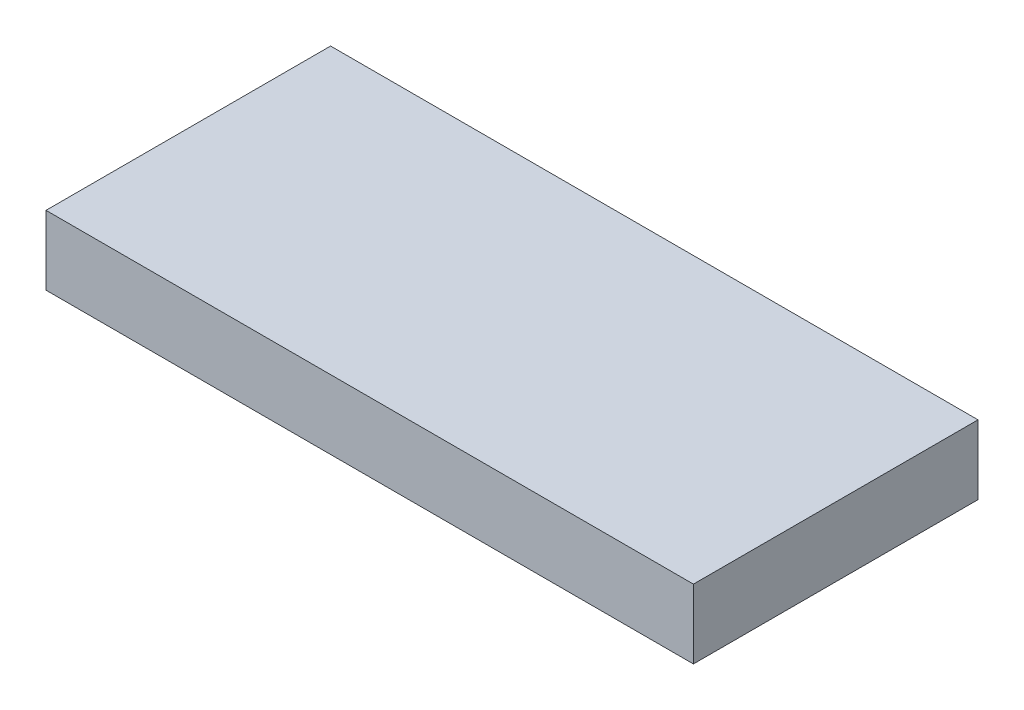
ISO-10303-21;
HEADER;
FILE_DESCRIPTION(('STEP AP214'),'2;1');
FILE_NAME('part.step','',(''),(''),'','','');
FILE_SCHEMA(('AUTOMOTIVE_DESIGN { 1 0 10303 214 1 1 1 1 }'));
ENDSEC;
DATA;
#1=APPLICATION_CONTEXT('core data for automotive mechanical design processes');
#2=APPLICATION_PROTOCOL_DEFINITION('international standard','automotive_design',2000,#1);
#3=PRODUCT_CONTEXT('',#1,'mechanical');
#4=PRODUCT('Part','Part','',(#3));
#5=PRODUCT_RELATED_PRODUCT_CATEGORY('part','',(#4));
#6=PRODUCT_DEFINITION_FORMATION('','',#4);
#7=PRODUCT_DEFINITION_CONTEXT('part definition',#1,'design');
#8=PRODUCT_DEFINITION('design','',#6,#7);
#9=PRODUCT_DEFINITION_SHAPE('','',#8);
#10=(LENGTH_UNIT() NAMED_UNIT(*) SI_UNIT(.MILLI.,.METRE.));
#11=(NAMED_UNIT(*) PLANE_ANGLE_UNIT() SI_UNIT($,.RADIAN.));
#12=(NAMED_UNIT(*) SI_UNIT($,.STERADIAN.) SOLID_ANGLE_UNIT());
#13=UNCERTAINTY_MEASURE_WITH_UNIT(LENGTH_MEASURE(1.E-05),#10,'distance_accuracy_value','');
#14=(GEOMETRIC_REPRESENTATION_CONTEXT(3) GLOBAL_UNCERTAINTY_ASSIGNED_CONTEXT((#13)) GLOBAL_UNIT_ASSIGNED_CONTEXT((#10,
#11,#12)) REPRESENTATION_CONTEXT('',''));
#15=CARTESIAN_POINT('',(0.,0.,0.));
#16=DIRECTION('',(0.,0.,1.));
#17=DIRECTION('',(1.,0.,0.));
#18=AXIS2_PLACEMENT_3D('',#15,#16,#17);
#19=CARTESIAN_POINT('',(-150.,-17.,81.405771285938));
#20=CARTESIAN_POINT('',(-116.638846737262,-17.6672118608523,80.8095738798847));
#21=CARTESIAN_POINT('',(-49.7427742053213,-19.0051108443265,79.6140736942468));
#22=CARTESIAN_POINT('',(50.6317027871444,-21.0127703181343,65.3499909791472));
#23=CARTESIAN_POINT('',(151.227954208533,-23.0240357792725,40.5691423295298));
#24=CARTESIAN_POINT('',(216.774855827415,-24.3366500190966,13.6494309993884));
#25=CARTESIAN_POINT('',(249.9,-25.,0.0451370225326122));
#26=CARTESIAN_POINT('',(-150.,-21.8051540860384,75.7963536954995));
#27=CARTESIAN_POINT('',(-116.638846737262,-22.5655101612967,75.3244737477681));
#28=CARTESIAN_POINT('',(-49.7427742053213,-24.0901827276193,74.3782560027998));
#29=CARTESIAN_POINT('',(50.6317027871444,-25.3526769380671,60.9130466986286));
#30=CARTESIAN_POINT('',(151.227954208533,-26.3707911350128,39.0705039634522));
#31=CARTESIAN_POINT('',(216.774855827415,-27.7472853242932,13.1463238474013));
#32=CARTESIAN_POINT('',(249.9,-28.4429180292189,0.0451370225326118));
#33=CARTESIAN_POINT('',(-150.,-30.4196988845977,63.7246782220816));
#34=CARTESIAN_POINT('',(-116.638846737262,-31.3659657699669,63.4502856806367));
#35=CARTESIAN_POINT('',(-49.7427742053213,-33.2634282977069,62.9000713876785));
#36=CARTESIAN_POINT('',(50.6317027871446,-33.106174464079,51.2985487065188));
#37=CARTESIAN_POINT('',(151.227954208533,-32.7893086977552,34.7857992726971));
#38=CARTESIAN_POINT('',(216.774855827415,-33.8681584780577,11.7060337279786));
#39=CARTESIAN_POINT('',(249.9,-34.4133719607769,0.0423159586243231));
#40=CARTESIAN_POINT('',(-150.,-39.9491696874336,43.6235895569039));
#41=CARTESIAN_POINT('',(-116.638846737262,-41.1292967625243,43.5175237114742));
#42=CARTESIAN_POINT('',(-49.7427742053211,-43.4956977616275,43.3048395625438));
#43=CARTESIAN_POINT('',(50.6317027871442,-41.6370640720175,35.1670631615842));
#44=CARTESIAN_POINT('',(151.227954208534,-40.5287833395358,25.1330207184538));
#45=CARTESIAN_POINT('',(216.774855827415,-40.6321518122783,8.45847664431594));
#46=CARTESIAN_POINT('',(249.9,-40.6843906744964,0.0317369689682422));
#47=CARTESIAN_POINT('',(-150.,-45.7889049113112,22.1583537592279));
#48=CARTESIAN_POINT('',(-116.638846737262,-47.1240890131779,22.1291663050477));
#49=CARTESIAN_POINT('',(-49.7427742053214,-49.8014117009921,22.0706393699479));
#50=CARTESIAN_POINT('',(50.6317027871445,-46.8411508509107,17.8763287205671));
#51=CARTESIAN_POINT('',(151.227954208534,-45.5486295254136,13.1697217970133));
#52=CARTESIAN_POINT('',(216.774855827415,-44.7405878200843,4.43244489076427));
#53=CARTESIAN_POINT('',(249.9,-44.3322314016204,0.0169263834497292));
#54=CARTESIAN_POINT('',(-150.,-47.7559083208649,0.));
#55=CARTESIAN_POINT('',(-116.638846737262,-49.1459003431606,0.));
#56=CARTESIAN_POINT('',(-49.7427742053212,-51.9331243461798,0.));
#57=CARTESIAN_POINT('',(50.6317027871444,-48.5824626978723,0.));
#58=CARTESIAN_POINT('',(151.227954208533,-47.3149233158318,0.));
#59=CARTESIAN_POINT('',(216.774855827415,-46.0550665245405,0.));
#60=CARTESIAN_POINT('',(249.9,-45.4183783391708,0.));
#61=CARTESIAN_POINT('',(-150.,-45.7889049113112,-22.1583537592281));
#62=CARTESIAN_POINT('',(-116.638846737262,-47.1259260630216,-22.1291663050479));
#63=CARTESIAN_POINT('',(-49.7427742053212,-49.8069324190415,-22.0706393699482));
#64=CARTESIAN_POINT('',(50.631702787144,-46.8188095609941,-17.8763287205673));
#65=CARTESIAN_POINT('',(151.227954208535,-45.6344294759758,-13.1697217970134));
#66=CARTESIAN_POINT('',(216.774855827415,-44.5515603869442,-4.43244489076432));
#67=CARTESIAN_POINT('',(249.9,-44.0043156841697,-0.0169263834497295));
#68=CARTESIAN_POINT('',(-150.,-39.9491696874333,-43.6235895569039));
#69=CARTESIAN_POINT('',(-116.638846737262,-41.13228196852,-43.5175237114741));
#70=CARTESIAN_POINT('',(-49.7427742053215,-43.5046689284581,-43.3048395625436));
#71=CARTESIAN_POINT('',(50.6317027871449,-41.6007594759027,-35.1670631615843));
#72=CARTESIAN_POINT('',(151.227954208532,-40.6682082591992,-25.1330207184536));
#73=CARTESIAN_POINT('',(216.774855827415,-40.3249822334255,-8.45847664431589));
#74=CARTESIAN_POINT('',(249.9,-40.1515276336391,-0.0317369689682436));
#75=CARTESIAN_POINT('',(-150.,-30.4196988845977,-63.7246782220818));
#76=CARTESIAN_POINT('',(-116.638846737262,-31.3687213447323,-63.4502856806368));
#77=CARTESIAN_POINT('',(-49.7427742053211,-33.2717093747809,-62.9000713876787));
#78=CARTESIAN_POINT('',(50.631702787144,-33.072662529204,-51.298548706519));
#79=CARTESIAN_POINT('',(151.227954208534,-32.9180086235985,-34.7857992726972));
#80=CARTESIAN_POINT('',(216.774855827415,-33.5846173283475,-11.7060337279786));
#81=CARTESIAN_POINT('',(249.9,-33.921498384601,-0.0423159586243264));
#82=CARTESIAN_POINT('',(-150.,-21.8051540860384,-75.7963536954995));
#83=CARTESIAN_POINT('',(-116.638846737262,-22.5667348611924,-75.3244737477681));
#84=CARTESIAN_POINT('',(-49.7427742053213,-24.0938632063189,-74.3782560027999));
#85=CARTESIAN_POINT('',(50.6317027871444,-25.3377827447892,-60.9130466986286));
#86=CARTESIAN_POINT('',(151.227954208533,-26.4279911020543,-39.0705039634522));
#87=CARTESIAN_POINT('',(216.774855827415,-27.6212670355331,-13.1463238474013));
#88=CARTESIAN_POINT('',(249.9,-28.2243075509185,-0.0451370225326169));
#89=CARTESIAN_POINT('',(-150.,-17.,-81.405771285938));
#90=CARTESIAN_POINT('',(-116.638846737262,-17.6672118608522,-80.8095738798847));
#91=CARTESIAN_POINT('',(-49.7427742053213,-19.0051108443264,-79.614073694247));
#92=CARTESIAN_POINT('',(50.6317027871444,-21.0127703181342,-65.3499909791472));
#93=CARTESIAN_POINT('',(151.227954208533,-23.0240357792725,-40.5691423295299));
#94=CARTESIAN_POINT('',(216.774855827415,-24.3366500190966,-13.6494309993884));
#95=CARTESIAN_POINT('',(249.9,-25.,-0.0451370225326184));
#96=B_SPLINE_SURFACE_WITH_KNOTS('',3,3,((#19,#20,#21,#22,#23,#24,#25),(#26,#27,#28,#29,#30,#31,
#32),(#33,#34,#35,#36,#37,#38,#39),(#40,#41,#42,#43,#44,#45,#46),(#47,#48,#49,#50,#51,#52,#53),
(#54,#55,#56,#57,#58,#59,#60),(#61,#62,#63,#64,#65,#66,#67),(#68,#69,#70,#71,#72,#73,#74),(#75,
#76,#77,#78,#79,#80,#81),(#82,#83,#84,#85,#86,#87,#88),(#89,#90,#91,#92,#93,#94,#95)),
.UNSPECIFIED.,.F.,.F.,.F.,(4,1,1,1,1,1,1,1,4),(4,1,1,1,4),(0.,0.125,0.25,0.375,0.5,0.625,0.75,
0.875,1.),(0.,0.246022042488694,0.493325523526259,0.743944188554489,1.),.UNSPECIFIED.);
#97=CARTESIAN_POINT('',(-150.,-30.000000000094,63.1438135401164));
#98=CARTESIAN_POINT('',(-148.303174488047,-30.0000000000338,63.2109087051731));
#99=CARTESIAN_POINT('',(-146.606322308969,-30.000000000009,63.277348864486));
#100=CARTESIAN_POINT('',(-143.212498847984,-29.999999999991,63.4082834233983));
#101=CARTESIAN_POINT('',(-141.515527564128,-29.9999999999976,63.4727777723948));
#102=CARTESIAN_POINT('',(-138.121462040788,-30.0000000000024,63.5991823874871));
#103=CARTESIAN_POINT('',(-136.424367799808,-30.0000000000006,63.6610926135786));
#104=CARTESIAN_POINT('',(-133.030053619916,-29.9999999999993,63.7817049716669));
#105=CARTESIAN_POINT('',(-131.332833680239,-29.9999999999998,63.8404070822541));
#106=CARTESIAN_POINT('',(-127.93826552419,-30.0000000000002,63.9539883800537));
#107=CARTESIAN_POINT('',(-126.240917307825,-30.,64.0088675674974));
#108=CARTESIAN_POINT('',(-122.846090393193,-30.,64.1141974889702));
#109=CARTESIAN_POINT('',(-121.14861169553,-30.,64.1646482423859));
#110=CARTESIAN_POINT('',(-117.753433092101,-30.,64.260526299464));
#111=CARTESIAN_POINT('',(-116.055733179729,-30.,64.3059533701372));
#112=CARTESIAN_POINT('',(-112.660197008215,-30.,64.3911906408751));
#113=CARTESIAN_POINT('',(-110.962360749514,-30.,64.4310008584292));
#114=CARTESIAN_POINT('',(-107.566547651452,-30.,64.5044202100621));
#115=CARTESIAN_POINT('',(-105.868570811633,-30.,64.538029323094));
#116=CARTESIAN_POINT('',(-102.472472627765,-30.,64.5984675228034));
#117=CARTESIAN_POINT('',(-100.774351282057,-30.,64.6252965168175));
#118=CARTESIAN_POINT('',(-97.3779594205936,-30.,64.6715998564886));
#119=CARTESIAN_POINT('',(-95.6796889019914,-30.,64.6910739961439));
#120=CARTESIAN_POINT('',(-92.2829971369807,-30.,64.722096698709));
#121=CARTESIAN_POINT('',(-90.5845758872372,-30.,64.7336448912877));
#122=CARTESIAN_POINT('',(-85.4777005511371,-30.,64.7555965747348));
#123=CARTESIAN_POINT('',(-82.0691790534721,-30.,64.7531418645007));
#124=CARTESIAN_POINT('',(-75.2521151613664,-30.,64.7094654784167));
#125=CARTESIAN_POINT('',(-71.8435727831338,-30.,64.6682410078079));
#126=CARTESIAN_POINT('',(-66.7313803213126,-30.,64.573938876537));
#127=CARTESIAN_POINT('',(-65.0274220727421,-30.,64.5370940029457));
#128=CARTESIAN_POINT('',(-61.619786899533,-30.,64.4520211481255));
#129=CARTESIAN_POINT('',(-59.9161099749199,-30.,64.4037931658663));
#130=CARTESIAN_POINT('',(-56.5091960956182,-30.,64.2953931343788));
#131=CARTESIAN_POINT('',(-54.8059591270966,-30.,64.2352215228313));
#132=CARTESIAN_POINT('',(-52.2514721688442,-30.,64.1355927523358));
#133=CARTESIAN_POINT('',(-51.4000375501818,-30.,64.1008212522839));
#134=CARTESIAN_POINT('',(-49.6973052302404,-30.,64.0280738154914));
#135=CARTESIAN_POINT('',(-48.8460075289687,-30.,63.9900978785816));
#136=CARTESIAN_POINT('',(-46.2923815641978,-30.,63.8714199545743));
#137=CARTESIAN_POINT('',(-44.5902716752403,-30.,63.7859659515517));
#138=CARTESIAN_POINT('',(-41.1867126235601,-30.,63.6028465417992));
#139=CARTESIAN_POINT('',(-39.4852634615501,-30.,63.5051811219336));
#140=CARTESIAN_POINT('',(-34.3821298354002,-30.,63.1945195524769));
#141=CARTESIAN_POINT('',(-30.981507247715,-30.,62.9638509521825));
#142=CARTESIAN_POINT('',(-24.1835172351267,-30.,62.4586964195533));
#143=CARTESIAN_POINT('',(-20.7861498378634,-30.,62.1842101184237));
#144=CARTESIAN_POINT('',(-13.9947932701885,-30.,61.5945509679733));
#145=CARTESIAN_POINT('',(-10.6008042682078,-30.,61.2793761833686));
#146=CARTESIAN_POINT('',(-3.81632360834457,-30.,60.6113582098535));
#147=CARTESIAN_POINT('',(-0.425832193290021,-30.,60.2585125627398));
#148=CARTESIAN_POINT('',(6.35153114557136,-30.,59.5180860243212));
#149=CARTESIAN_POINT('',(9.73840286456164,-30.,59.1305032628925));
#150=CARTESIAN_POINT('',(16.5083946786765,-30.,58.3234722531869));
#151=CARTESIAN_POINT('',(19.8915147109152,-30.,57.9040234787241));
#152=CARTESIAN_POINT('',(26.6538703401469,-30.,57.036077348936));
#153=CARTESIAN_POINT('',(30.0331061013356,-30.,56.5875812711835));
#154=CARTESIAN_POINT('',(35.4304408887764,-30.,55.8498060895503));
#155=CARTESIAN_POINT('',(37.4497022512696,-30.,55.5689881368893));
#156=CARTESIAN_POINT('',(41.4868479699227,-30.,54.9985166756687));
#157=CARTESIAN_POINT('',(43.5047324048297,-30.,54.7088637249445));
#158=CARTESIAN_POINT('',(46.5306102530659,-30.,54.2681598203254));
#159=CARTESIAN_POINT('',(47.5390586802216,-30.,54.1202240110798));
#160=CARTESIAN_POINT('',(49.5556611062366,-30.,53.8223589800068));
#161=CARTESIAN_POINT('',(50.5638151050935,-30.,53.672429758163));
#162=CARTESIAN_POINT('',(53.5877908081136,-30.,53.2196346994404));
#163=CARTESIAN_POINT('',(55.6031624935621,-30.,52.913756185464));
#164=CARTESIAN_POINT('',(59.6325741740228,-30.,52.2932666218014));
#165=CARTESIAN_POINT('',(61.6466141608582,-30.,51.9786555189959));
#166=CARTESIAN_POINT('',(65.6729067879237,-30.,51.3400965315165));
#167=CARTESIAN_POINT('',(67.6851596498867,-30.,51.0161500460558));
#168=CARTESIAN_POINT('',(71.7080514048187,-30.,50.358196349437));
#169=CARTESIAN_POINT('',(73.7186902736374,-30.,50.0241889905155));
#170=CARTESIAN_POINT('',(77.7381668563762,-30.,49.3454363570875));
#171=CARTESIAN_POINT('',(79.7470045608019,-30.,49.0006910263164));
#172=CARTESIAN_POINT('',(83.7626893900216,-30.,48.2997723911528));
#173=CARTESIAN_POINT('',(85.7695365121799,-30.,47.9435990716493));
#174=CARTESIAN_POINT('',(89.7810485265083,-30.,47.2191213481386));
#175=CARTESIAN_POINT('',(91.7857134111312,-30.,46.8508169023133));
#176=CARTESIAN_POINT('',(95.7941160974211,-30.,46.1010881665573));
#177=CARTESIAN_POINT('',(97.7978521325725,-30.,45.719654425564));
#178=CARTESIAN_POINT('',(101.802697049571,-30.,44.9431945431398));
#179=CARTESIAN_POINT('',(103.803805923334,-30.,44.5481683599839));
#180=CARTESIAN_POINT('',(107.803145334671,-30.,43.7437839979624));
#181=CARTESIAN_POINT('',(109.801375868994,-30.,43.3344258029281));
#182=CARTESIAN_POINT('',(113.794704394706,-30.,42.5006229113007));
#183=CARTESIAN_POINT('',(115.789802362787,-30.,42.0761781030077));
#184=CARTESIAN_POINT('',(119.776608410611,-30.,41.2114327356625));
#185=CARTESIAN_POINT('',(121.768316412801,-30.,40.7711318188397));
#186=CARTESIAN_POINT('',(125.748045075474,-30.,39.8738991782947));
#187=CARTESIAN_POINT('',(127.736065629517,-30.,39.4169669821186));
#188=CARTESIAN_POINT('',(131.708046624629,-30.,38.4857018283268));
#189=CARTESIAN_POINT('',(133.692007030315,-30.,38.0113687197462));
#190=CARTESIAN_POINT('',(137.655456690163,-30.,37.0445335916654));
#191=CARTESIAN_POINT('',(139.634946040606,-30.,36.5520319674526));
#192=CARTESIAN_POINT('',(142.600524170553,-30.,35.7990712610573));
#193=CARTESIAN_POINT('',(143.588422377687,-30.,35.5457212057149));
#194=CARTESIAN_POINT('',(145.562966713574,-30.,35.0341859320255));
#195=CARTESIAN_POINT('',(146.549612842859,-30.,34.7760007157349));
#196=CARTESIAN_POINT('',(148.521551720992,-30.,34.2547036606292));
#197=CARTESIAN_POINT('',(149.506844533085,-30.,33.991592061074));
#198=CARTESIAN_POINT('',(151.476080145986,-30.,33.4603625329659));
#199=CARTESIAN_POINT('',(152.460022945557,-30.,33.1922445998249));
#200=CARTESIAN_POINT('',(154.807480775352,-30.,32.5463276675969));
#201=CARTESIAN_POINT('',(156.17037665555,-30.,32.166276138256));
#202=CARTESIAN_POINT('',(158.893608246793,-30.,31.3971121746864));
#203=CARTESIAN_POINT('',(160.253943953489,-30.,31.0079997250848));
#204=CARTESIAN_POINT('',(164.331242264044,-30.,29.8275319124085));
#205=CARTESIAN_POINT('',(167.044419595573,-30.,29.0230671615297));
#206=CARTESIAN_POINT('',(172.461221488424,-30.,27.3817146686648));
#207=CARTESIAN_POINT('',(175.164845076496,-30.,26.5448237216978));
#208=CARTESIAN_POINT('',(180.563059597437,-30.,24.8412124982684));
#209=CARTESIAN_POINT('',(183.257649301219,-30.,23.9744883303101));
#210=CARTESIAN_POINT('',(188.638316276971,-30.,22.2138575544842));
#211=CARTESIAN_POINT('',(191.324392380644,-30.,21.3199473803461));
#212=CARTESIAN_POINT('',(196.688572656636,-30.,19.5076415764406));
#213=CARTESIAN_POINT('',(199.366675975254,-30.,18.589243422487));
#214=CARTESIAN_POINT('',(204.718629963381,-30.,16.7296099147426));
#215=CARTESIAN_POINT('',(207.392471335761,-30.,15.7883478328095));
#216=CARTESIAN_POINT('',(212.733287523653,-30.,13.8868419438205));
#217=CARTESIAN_POINT('',(215.40026256722,-30.,12.9265987766295));
#218=CARTESIAN_POINT('',(220.727936241924,-30.,10.9899796444893));
#219=CARTESIAN_POINT('',(223.38863566916,-30.,10.0136058672683));
#220=CARTESIAN_POINT('',(228.704363037846,-30.,8.04761288768313));
#221=CARTESIAN_POINT('',(231.359392248565,-30.,7.05799711382233));
#222=CARTESIAN_POINT('',(236.664393540274,-30.,5.06843851848005));
#223=CARTESIAN_POINT('',(239.314367188139,-30.,4.06849986921668));
#224=CARTESIAN_POINT('',(244.609889430148,-30.,2.06124101394102));
#225=CARTESIAN_POINT('',(247.255439637464,-30.,1.05392506601491));
#226=CARTESIAN_POINT('',(249.9,-30.,0.0440428964813235));
#227=B_SPLINE_CURVE_WITH_KNOTS('',3,(#97,#98,#99,#100,#101,#102,#103,#104,#105,#106,#107,#108,
#109,#110,#111,#112,#113,#114,#115,#116,#117,#118,#119,#120,#121,#122,#123,#124,#125,#126,#127,
#128,#129,#130,#131,#132,#133,#134,#135,#136,#137,#138,#139,#140,#141,#142,#143,#144,#145,#146,
#147,#148,#149,#150,#151,#152,#153,#154,#155,#156,#157,#158,#159,#160,#161,#162,#163,#164,#165,
#166,#167,#168,#169,#170,#171,#172,#173,#174,#175,#176,#177,#178,#179,#180,#181,#182,#183,#184,
#185,#186,#187,#188,#189,#190,#191,#192,#193,#194,#195,#196,#197,#198,#199,#200,#201,#202,#203,
#204,#205,#206,#207,#208,#209,#210,#211,#212,#213,#214,#215,#216,#217,#218,#219,#220,#221,#222,
#223,#224,#225,#226),.UNSPECIFIED.,.F.,.F.,(4,2,2,2,2,2,2,2,2,2,2,2,2,2,2,2,2,2,2,2,2,2,2,2,2,2,
2,2,2,2,2,2,2,2,2,2,2,2,2,2,2,2,2,2,2,2,2,2,2,2,2,2,2,2,2,2,2,2,2,2,2,2,2,2,4),(0.,
5.09445560444609,10.1890435814435,15.2837103972693,20.3784112086652,25.4731117118842,
30.5677899108129,35.6627042927385,40.7576028100066,45.8525186192425,50.9475040565552,
56.0426321884293,61.1379983683537,71.3633653164922,81.58946942743,86.7025071503557,
91.8155453361055,96.9283961863908,99.4848239039344,102.041251756476,107.153961060412,
112.266675864075,122.491649058579,132.716708316855,142.942254093364,153.168467543795,
163.395231868606,173.622165099063,183.84864882859,189.9647151615,196.080396126545,
199.138118981614,202.195841862067,208.311177650781,214.426550646513,220.541011771961,
226.655562743916,232.770145760201,238.884736862046,244.999349044169,251.118458842121,
257.237587425712,263.356722912813,269.475903714851,275.595222674152,281.714715604216,
287.83426163765,293.953674608226,297.01326616608,300.072856422672,303.132298467457,
306.191743316262,310.43638926004,314.681042405936,323.17058662244,331.660972090382,
340.152469287148,348.645085247693,357.1385800253,365.642533289389,374.146200366831,
382.648723443779,391.149086153615,399.646138203348,408.138621469009),.UNSPECIFIED.);
#228=CARTESIAN_POINT('',(-150.,-30.000000000094,63.1438135401164));
#229=VERTEX_POINT('',#228);
#230=CARTESIAN_POINT('',(249.9,-29.9999999948522,0.0440754122912198));
#231=VERTEX_POINT('',#230);
#232=EDGE_CURVE('E193',#229,#231,#227,.T.);
#233=CARTESIAN_POINT('',(-150.,78.0310764729347,0.));
#234=DIRECTION('',(1.,0.,0.));
#235=DIRECTION('',(0.,0.,1.));
#236=AXIS2_PLACEMENT_3D('',#233,#234,#235);
#237=CIRCLE('',#236,125.131151574111);
#238=CARTESIAN_POINT('',(-150.,-17.,81.405771285938));
#239=VERTEX_POINT('',#238);
#240=EDGE_CURVE('E171',#239,#229,#237,.T.);
#241=CARTESIAN_POINT('',(-150.,-17.,81.405771285938));
#242=CARTESIAN_POINT('',(-116.638846737262,-17.6672118608523,80.8095738798847));
#243=CARTESIAN_POINT('',(-49.7427742053213,-19.0051108443265,79.6140736942468));
#244=CARTESIAN_POINT('',(50.6317027871444,-21.0127703181343,65.3499909791472));
#245=CARTESIAN_POINT('',(151.227954208533,-23.0240357792725,40.5691423295298));
#246=CARTESIAN_POINT('',(216.774855827415,-24.3366500190966,13.6494309993884));
#247=CARTESIAN_POINT('',(249.9,-25.,0.0451370225326122));
#248=B_SPLINE_CURVE_WITH_KNOTS('',3,(#241,#242,#243,#244,#245,#246,#247),.UNSPECIFIED.,.F.,.F.,
(4,1,1,1,4),(0.,0.246022042488694,0.493325523526259,0.743944188554489,1.),.UNSPECIFIED.);
#249=CARTESIAN_POINT('',(249.9,-25.,0.0451370225326122));
#250=VERTEX_POINT('',#249);
#251=EDGE_CURVE('E363',#239,#250,#248,.T.);
#252=CARTESIAN_POINT('',(249.9,-25.,0.0451370225326122));
#253=CARTESIAN_POINT('',(249.9,-28.4429180292189,0.0451370225326118));
#254=CARTESIAN_POINT('',(249.9,-34.4133719607769,0.0423159586243231));
#255=CARTESIAN_POINT('',(249.9,-40.6843906744964,0.0317369689682422));
#256=CARTESIAN_POINT('',(249.9,-44.3322314016204,0.0169263834497292));
#257=CARTESIAN_POINT('',(249.9,-45.4183783391708,0.));
#258=CARTESIAN_POINT('',(249.9,-44.0043156841697,-0.0169263834497295));
#259=CARTESIAN_POINT('',(249.9,-40.1515276336391,-0.0317369689682436));
#260=CARTESIAN_POINT('',(249.9,-33.921498384601,-0.0423159586243264));
#261=CARTESIAN_POINT('',(249.9,-28.2243075509185,-0.0451370225326169));
#262=CARTESIAN_POINT('',(249.9,-25.,-0.0451370225326184));
#263=B_SPLINE_CURVE_WITH_KNOTS('',3,(#252,#253,#254,#255,#256,#257,#258,#259,#260,#261,#262),
.UNSPECIFIED.,.F.,.F.,(4,1,1,1,1,1,1,1,4),(0.,0.125,0.25,0.375,0.5,0.625,0.75,0.875,1.),.UNSPECIFIED.);
#264=EDGE_CURVE('E450',#250,#231,#263,.T.);
#265=ORIENTED_EDGE('',*,*,#232,.F.);
#266=ORIENTED_EDGE('',*,*,#240,.F.);
#267=ORIENTED_EDGE('',*,*,#251,.T.);
#268=ORIENTED_EDGE('',*,*,#264,.T.);
#269=EDGE_LOOP('',(#265,#266,#267,#268));
#270=FACE_BOUND('',#269,.T.);
#271=ADVANCED_FACE('F167',(#270),#96,.F.);
#272=CARTESIAN_POINT('',(249.9,-30.0000000000039,-0.0439039966229397));
#273=CARTESIAN_POINT('',(248.525003905595,-30.0000000000014,-0.566016888253522));
#274=CARTESIAN_POINT('',(247.149781355388,-30.0000000000004,-1.08753477787595));
#275=CARTESIAN_POINT('',(244.39874255809,-29.9999999999996,-2.12900047401064));
#276=CARTESIAN_POINT('',(243.022926311229,-29.9999999999999,-2.6489482811317));
#277=CARTESIAN_POINT('',(240.270559768479,-30.0000000000001,-3.68689357328367));
#278=CARTESIAN_POINT('',(238.894009473392,-30.,-4.20489106043884));
#279=CARTESIAN_POINT('',(236.139379192437,-30.,-5.23880195783158));
#280=CARTESIAN_POINT('',(234.761298790403,-30.,-5.75471425954916));
#281=CARTESIAN_POINT('',(232.004123088798,-30.,-6.78382636157928));
#282=CARTESIAN_POINT('',(230.625027787873,-30.,-7.29702615826424));
#283=CARTESIAN_POINT('',(227.865682586439,-30.,-8.32033334653465));
#284=CARTESIAN_POINT('',(226.485432680283,-30.,-8.83044072288993));
#285=CARTESIAN_POINT('',(223.032595316343,-30.,-10.1015879910296));
#286=CARTESIAN_POINT('',(220.959206162864,-30.,-10.8604525372619));
#287=CARTESIAN_POINT('',(216.809104001261,-30.,-12.3690608327822));
#288=CARTESIAN_POINT('',(214.732390983892,-30.,-13.118804556653));
#289=CARTESIAN_POINT('',(210.575235498536,-30.,-14.6078671272578));
#290=CARTESIAN_POINT('',(208.494793041981,-30.,-15.3471860058827));
#291=CARTESIAN_POINT('',(204.3297740137,-30.,-16.8140958865783));
#292=CARTESIAN_POINT('',(202.245197440376,-30.,-17.5416868841134));
#293=CARTESIAN_POINT('',(198.0724623665,-30.,-18.9835083680896));
#294=CARTESIAN_POINT('',(195.984305868316,-30.,-19.6977446456116));
#295=CARTESIAN_POINT('',(191.80312755306,-30.,-21.1118746062777));
#296=CARTESIAN_POINT('',(189.710105712348,-30.,-21.811768219567));
#297=CARTESIAN_POINT('',(185.518852866269,-30.,-23.1958946923459));
#298=CARTESIAN_POINT('',(183.420621787012,-30.,-23.8801273282702));
#299=CARTESIAN_POINT('',(179.218610265836,-30.,-25.2316137053305));
#300=CARTESIAN_POINT('',(177.114829618895,-30.,-25.8988668092012));
#301=CARTESIAN_POINT('',(172.190829235871,-30.,-27.4370410009175));
#302=CARTESIAN_POINT('',(169.368345573389,-30.,-28.3007306257715));
#303=CARTESIAN_POINT('',(163.712380502053,-30.,-29.992136667254));
#304=CARTESIAN_POINT('',(160.87889833194,-30.,-30.8198505436633));
#305=CARTESIAN_POINT('',(156.62028111908,-30.,-32.0319704494908));
#306=CARTESIAN_POINT('',(155.199328072636,-30.,-32.4311059745819));
#307=CARTESIAN_POINT('',(152.354585419883,-30.,-33.2191353354822));
#308=CARTESIAN_POINT('',(150.930795815755,-30.,-33.6080291791656));
#309=CARTESIAN_POINT('',(146.655158472134,-30.,-34.7588432522044));
#310=CARTESIAN_POINT('',(143.799026383986,-30.,-35.504900533718));
#311=CARTESIAN_POINT('',(138.076659476911,-30.,-36.9569840842948));
#312=CARTESIAN_POINT('',(135.210424756159,-30.,-37.6630107412317));
#313=CARTESIAN_POINT('',(129.469066999094,-30.,-39.0372307378007));
#314=CARTESIAN_POINT('',(126.593944439293,-30.,-39.7054260698549));
#315=CARTESIAN_POINT('',(120.832557546992,-30.,-41.0070267027425));
#316=CARTESIAN_POINT('',(117.946284493925,-30.,-41.6403933482423));
#317=CARTESIAN_POINT('',(112.16664184067,-30.,-42.8738695887667));
#318=CARTESIAN_POINT('',(109.273272220996,-30.,-43.4739790923716));
#319=CARTESIAN_POINT('',(103.480195344557,-30.,-44.6432866912031));
#320=CARTESIAN_POINT('',(100.580487866048,-30.,-45.2124836862861));
#321=CARTESIAN_POINT('',(94.7754897149422,-30.,-46.3222904418708));
#322=CARTESIAN_POINT('',(91.870198813586,-30.,-46.862899004034));
#323=CARTESIAN_POINT('',(86.0547834394392,-30.,-47.9178302561482));
#324=CARTESIAN_POINT('',(83.1446588520983,-30.,-48.4321523137051));
#325=CARTESIAN_POINT('',(77.3203234888844,-30.,-49.4367892824901));
#326=CARTESIAN_POINT('',(74.4061127776338,-30.,-49.9271045690788));
#327=CARTESIAN_POINT('',(68.1935650634764,-30.,-50.948590531326));
#328=CARTESIAN_POINT('',(64.8947317788405,-30.,-51.4767420735728));
#329=CARTESIAN_POINT('',(59.9437217914089,-30.,-52.2506021982707));
#330=CARTESIAN_POINT('',(58.292971363065,-30.,-52.505487497677));
#331=CARTESIAN_POINT('',(54.9905950993985,-30.,-53.0095302393482));
#332=CARTESIAN_POINT('',(53.3389692638509,-30.,-53.2586876801405));
#333=CARTESIAN_POINT('',(50.0349552835981,-30.,-53.7517520453726));
#334=CARTESIAN_POINT('',(48.3825671484476,-30.,-53.9956590338882));
#335=CARTESIAN_POINT('',(45.077013576005,-30.,-54.4781473147619));
#336=CARTESIAN_POINT('',(43.4238481388958,-30.,-54.716728608373));
#337=CARTESIAN_POINT('',(40.1166662350948,-30.,-55.1882124839506));
#338=CARTESIAN_POINT('',(38.4626497488052,-30.,-55.4211149285671));
#339=CARTESIAN_POINT('',(35.1537857994906,-30.,-55.8809343515646));
#340=CARTESIAN_POINT('',(33.4989383364633,-30.,-56.1078513299304));
#341=CARTESIAN_POINT('',(28.5328768809106,-30.,-56.7791726304867));
#342=CARTESIAN_POINT('',(25.2203764671111,-30.,-57.2141140612297));
#343=CARTESIAN_POINT('',(18.5947272930632,-30.,-58.0557718376539));
#344=CARTESIAN_POINT('',(15.2815816254934,-30.,-58.4625125014017));
#345=CARTESIAN_POINT('',(8.65165552198158,-30.,-59.2454928249023));
#346=CARTESIAN_POINT('',(5.3348750610144,-30.,-59.621732273303));
#347=CARTESIAN_POINT('',(-1.30210586656756,-30.,-60.3409215242471));
#348=CARTESIAN_POINT('',(-4.6223061221263,-30.,-60.6838732697592));
#349=CARTESIAN_POINT('',(-11.2659212119177,-30.,-61.3336401098729));
#350=CARTESIAN_POINT('',(-14.5893356962466,-30.,-61.6404587704356));
#351=CARTESIAN_POINT('',(-21.239174895461,-30.,-62.2150363711028));
#352=CARTESIAN_POINT('',(-24.5655992348615,-30.,-62.482799647235));
#353=CARTESIAN_POINT('',(-31.2739618877537,-30.,-62.9801520170514));
#354=CARTESIAN_POINT('',(-34.6559500983379,-30.,-63.2090741205794));
#355=CARTESIAN_POINT('',(-39.731093432748,-30.,-63.5174013021972));
#356=CARTESIAN_POINT('',(-41.4231974917082,-30.,-63.6143357479775));
#357=CARTESIAN_POINT('',(-44.808060071684,-30.,-63.7960847979629));
#358=CARTESIAN_POINT('',(-46.5008185919772,-30.,-63.8808994155075));
#359=CARTESIAN_POINT('',(-49.0404538569022,-30.,-63.9986802452971));
#360=CARTESIAN_POINT('',(-49.8871140701547,-30.,-64.0363682596446));
#361=CARTESIAN_POINT('',(-51.5805699321534,-30.,-64.1085679675403));
#362=CARTESIAN_POINT('',(-52.4273655808941,-30.,-64.1430796612179));
#363=CARTESIAN_POINT('',(-54.967933615967,-30.,-64.2419722211293));
#364=CARTESIAN_POINT('',(-56.6618885663371,-30.,-64.3017106344661));
#365=CARTESIAN_POINT('',(-60.0504115693031,-30.,-64.4093562968381));
#366=CARTESIAN_POINT('',(-61.7449796747166,-30.,-64.4572618723058));
#367=CARTESIAN_POINT('',(-65.1343944706653,-30.,-64.541786694431));
#368=CARTESIAN_POINT('',(-66.829241161189,-30.,-64.5784059415537));
#369=CARTESIAN_POINT('',(-71.9146465569205,-30.,-64.672174929291));
#370=CARTESIAN_POINT('',(-75.3055116213773,-30.,-64.7132185259106));
#371=CARTESIAN_POINT('',(-82.087962783941,-30.,-64.7568214427822));
#372=CARTESIAN_POINT('',(-85.4795489144517,-30.,-64.759375061611));
#373=CARTESIAN_POINT('',(-92.2699562204608,-30.,-64.7304467836814));
#374=CARTESIAN_POINT('',(-95.6687770539562,-30.,-64.6988906943753));
#375=CARTESIAN_POINT('',(-102.465986947028,-30.,-64.6061972679687));
#376=CARTESIAN_POINT('',(-105.864376008349,-30.,-64.545060054407));
#377=CARTESIAN_POINT('',(-112.660214324403,-30.,-64.3978473891579));
#378=CARTESIAN_POINT('',(-116.057663642141,-30.0000000000001,-64.3117747860953));
#379=CARTESIAN_POINT('',(-122.851116656198,-29.9999999999999,-64.1194363559251));
#380=CARTESIAN_POINT('',(-126.247120500403,-29.9999999999998,-64.0131756715953));
#381=CARTESIAN_POINT('',(-133.03717663755,-30.0000000000002,-63.7853154223741));
#382=CARTESIAN_POINT('',(-136.43122915122,-30.0000000000009,-63.6637223163256));
#383=CARTESIAN_POINT('',(-143.216894924073,-29.9999999999991,-63.4102459076328));
#384=CARTESIAN_POINT('',(-146.608508416077,-29.9999999999967,-63.2783688789415));
#385=CARTESIAN_POINT('',(-150.,-29.9999999999909,-63.1438135404537));
#386=B_SPLINE_CURVE_WITH_KNOTS('',3,(#272,#273,#274,#275,#276,#277,#278,#279,#280,#281,#282,
#283,#284,#285,#286,#287,#288,#289,#290,#291,#292,#293,#294,#295,#296,#297,#298,#299,#300,#301,
#302,#303,#304,#305,#306,#307,#308,#309,#310,#311,#312,#313,#314,#315,#316,#317,#318,#319,#320,
#321,#322,#323,#324,#325,#326,#327,#328,#329,#330,#331,#332,#333,#334,#335,#336,#337,#338,#339,
#340,#341,#342,#343,#344,#345,#346,#347,#348,#349,#350,#351,#352,#353,#354,#355,#356,#357,#358,
#359,#360,#361,#362,#363,#364,#365,#366,#367,#368,#369,#370,#371,#372,#373,#374,#375,#376,#377,
#378,#379,#380,#381,#382,#383,#384,#385),.UNSPECIFIED.,.F.,.F.,(4,2,2,2,2,2,2,2,2,2,2,2,2,2,2,2,
2,2,2,2,2,2,2,2,2,2,2,2,2,2,2,2,2,2,2,2,2,2,2,2,2,2,2,2,2,2,2,2,2,2,2,2,2,2,2,2,4),(0.,
4.412363367062,8.82472502304393,13.2370818717834,17.6515375189382,22.065999068317,
26.4804823412999,33.1041602246723,39.7278565621495,46.3515326325323,52.9752112644352,
59.5959477075333,66.2167163887623,72.8375795246334,79.4586907852569,88.3134904065683,
97.1689142459761,101.5967192653,106.024520880185,114.880074771367,123.735542842639,
132.590544097749,141.45518272327,150.319845715381,159.184823985091,168.050173553182,
176.915736301363,185.781160386774,195.803580296268,200.81450974045,205.825440472916,
210.836310017908,215.847178383944,220.858167824014,225.869157276794,235.891841195637,
245.905772009353,255.919772206675,265.933187545238,275.945613833831,285.956927670002,
296.125774647878,301.210374981812,306.294969719445,308.837460494965,311.379951166821,
316.464928080351,321.550623771989,326.636319253914,336.809387796693,346.983963235617,
357.180714165087,367.37742251054,377.572966440622,387.765916598674,397.954587191798,
408.137089853594),.UNSPECIFIED.);
#387=CARTESIAN_POINT('',(249.9,-29.9999999930648,-0.0439430814385722));
#388=VERTEX_POINT('',#387);
#389=CARTESIAN_POINT('',(-150.,-29.9999999999909,-63.1438135404537));
#390=VERTEX_POINT('',#389);
#391=EDGE_CURVE('E343',#388,#390,#386,.T.);
#392=CARTESIAN_POINT('',(249.9,-25.,-0.0451370225326184));
#393=VERTEX_POINT('',#392);
#394=EDGE_CURVE('E275',#388,#393,#263,.T.);
#395=CARTESIAN_POINT('',(-150.,-17.,-81.405771285938));
#396=CARTESIAN_POINT('',(-116.638846737262,-17.6672118608522,-80.8095738798847));
#397=CARTESIAN_POINT('',(-49.7427742053213,-19.0051108443264,-79.6140736942469));
#398=CARTESIAN_POINT('',(50.6317027871444,-21.0127703181342,-65.3499909791472));
#399=CARTESIAN_POINT('',(151.227954208533,-23.0240357792725,-40.5691423295299));
#400=CARTESIAN_POINT('',(216.774855827415,-24.3366500190966,-13.6494309993884));
#401=CARTESIAN_POINT('',(249.9,-25.,-0.0451370225326184));
#402=B_SPLINE_CURVE_WITH_KNOTS('',3,(#395,#396,#397,#398,#399,#400,#401),.UNSPECIFIED.,.F.,.F.,
(4,1,1,1,4),(0.,0.246022042488694,0.493325523526259,0.743944188554489,1.),.UNSPECIFIED.);
#403=CARTESIAN_POINT('',(-150.,-17.,-81.405771285938));
#404=VERTEX_POINT('',#403);
#405=EDGE_CURVE('E427',#404,#393,#402,.T.);
#406=EDGE_CURVE('E365',#390,#404,#237,.T.);
#407=ORIENTED_EDGE('',*,*,#391,.F.);
#408=ORIENTED_EDGE('',*,*,#394,.T.);
#409=ORIENTED_EDGE('',*,*,#405,.F.);
#410=ORIENTED_EDGE('',*,*,#406,.F.);
#411=EDGE_LOOP('',(#407,#408,#409,#410));
#412=FACE_BOUND('',#411,.T.);
#413=ADVANCED_FACE('F297',(#412),#96,.F.);
#414=CARTESIAN_POINT('',(-150.,78.0310764729347,0.));
#415=DIRECTION('',(1.,0.,0.));
#416=DIRECTION('',(0.,0.,-1.));
#417=AXIS2_PLACEMENT_3D('',#414,#415,#416);
#418=PLANE('',#417);
#419=ORIENTED_EDGE('',*,*,#240,.T.);
#420=DIRECTION('',(0.,0.,-1.));
#421=VECTOR('',#420,1.);
#422=CARTESIAN_POINT('',(-150.,-30.,0.));
#423=LINE('',#422,#421);
#424=EDGE_CURVE('E354',#229,#390,#423,.T.);
#425=ORIENTED_EDGE('',*,*,#424,.T.);
#426=ORIENTED_EDGE('',*,*,#406,.T.);
#427=DIRECTION('',(0.,1.,0.));
#428=VECTOR('',#427,1.);
#429=CARTESIAN_POINT('',(-150.,-8.49999999999998,-81.405771285938));
#430=LINE('',#429,#428);
#431=CARTESIAN_POINT('',(-150.,0.,-81.405771285938));
#432=VERTEX_POINT('',#431);
#433=EDGE_CURVE('E431',#404,#432,#430,.T.);
#434=ORIENTED_EDGE('',*,*,#433,.T.);
#435=DIRECTION('',(0.,0.,1.));
#436=VECTOR('',#435,1.);
#437=CARTESIAN_POINT('',(-150.,0.,0.));
#438=LINE('',#437,#436);
#439=CARTESIAN_POINT('',(-150.,0.,81.405771285938));
#440=VERTEX_POINT('',#439);
#441=EDGE_CURVE('E371',#432,#440,#438,.T.);
#442=ORIENTED_EDGE('',*,*,#441,.T.);
#443=DIRECTION('',(0.,-1.,0.));
#444=VECTOR('',#443,1.);
#445=CARTESIAN_POINT('',(-150.,-8.5,81.405771285938));
#446=LINE('',#445,#444);
#447=EDGE_CURVE('E367',#440,#239,#446,.T.);
#448=ORIENTED_EDGE('',*,*,#447,.T.);
#449=EDGE_LOOP('',(#419,#425,#426,#434,#442,#448));
#450=FACE_BOUND('',#449,.T.);
#451=ADVANCED_FACE('F369',(#450),#418,.T.);
#452=CARTESIAN_POINT('',(249.9,-45.0016767404122,0.));
#453=DIRECTION('',(-1.,0.,0.));
#454=DIRECTION('',(0.,0.,1.));
#455=AXIS2_PLACEMENT_3D('',#452,#453,#454);
#456=PLANE('',#455);
#457=ORIENTED_EDGE('',*,*,#394,.F.);
#458=DIRECTION('',(0.,0.,1.));
#459=VECTOR('',#458,1.);
#460=CARTESIAN_POINT('',(249.9,-30.,0.));
#461=LINE('',#460,#459);
#462=EDGE_CURVE('E12',#388,#231,#461,.T.);
#463=ORIENTED_EDGE('',*,*,#462,.T.);
#464=ORIENTED_EDGE('',*,*,#264,.F.);
#465=DIRECTION('',(0.,-1.,0.));
#466=VECTOR('',#465,1.);
#467=CARTESIAN_POINT('',(249.9,-12.5,0.0451370225326138));
#468=LINE('',#467,#466);
#469=CARTESIAN_POINT('',(249.9,0.,0.0451370225326153));
#470=VERTEX_POINT('',#469);
#471=EDGE_CURVE('E382',#470,#250,#468,.T.);
#472=ORIENTED_EDGE('',*,*,#471,.F.);
#473=DIRECTION('',(0.,0.,1.));
#474=VECTOR('',#473,1.);
#475=CARTESIAN_POINT('',(249.9,0.,0.));
#476=LINE('',#475,#474);
#477=CARTESIAN_POINT('',(249.9,0.,-0.0451370225326153));
#478=VERTEX_POINT('',#477);
#479=EDGE_CURVE('E458',#478,#470,#476,.T.);
#480=ORIENTED_EDGE('',*,*,#479,.F.);
#481=DIRECTION('',(0.,1.,0.));
#482=VECTOR('',#481,1.);
#483=CARTESIAN_POINT('',(249.9,-12.5,-0.0451370225326168));
#484=LINE('',#483,#482);
#485=EDGE_CURVE('E357',#393,#478,#484,.T.);
#486=ORIENTED_EDGE('',*,*,#485,.F.);
#487=EDGE_LOOP('',(#457,#463,#464,#472,#480,#486));
#488=FACE_BOUND('',#487,.T.);
#489=ADVANCED_FACE('F463',(#488),#456,.T.);
#490=CARTESIAN_POINT('',(-150.,0.,-81.405771285938));
#491=DIRECTION('',(0.,1.,0.));
#492=DIRECTION('',(0.,0.,1.));
#493=AXIS2_PLACEMENT_3D('',#490,#491,#492);
#494=PLANE('',#493);
#495=ORIENTED_EDGE('',*,*,#441,.F.);
#496=CARTESIAN_POINT('',(-150.,0.,-81.405771285938));
#497=CARTESIAN_POINT('',(-116.638846737262,0.,-80.8095738798847));
#498=CARTESIAN_POINT('',(-49.7427742053213,0.,-79.6140736942469));
#499=CARTESIAN_POINT('',(50.6317027871444,0.,-65.3499909791472));
#500=CARTESIAN_POINT('',(151.227954208533,0.,-40.5691423295299));
#501=CARTESIAN_POINT('',(216.774855827415,0.,-13.6494309993884));
#502=CARTESIAN_POINT('',(249.9,0.,-0.0451370225326153));
#503=B_SPLINE_CURVE_WITH_KNOTS('',3,(#496,#497,#498,#499,#500,#501,#502),.UNSPECIFIED.,.F.,.F.,
(4,1,1,1,4),(0.,0.246022042488694,0.493325523526259,0.743944188554489,1.),.UNSPECIFIED.);
#504=EDGE_CURVE('E433',#432,#478,#503,.T.);
#505=ORIENTED_EDGE('',*,*,#504,.T.);
#506=ORIENTED_EDGE('',*,*,#479,.T.);
#507=CARTESIAN_POINT('',(-150.,0.,81.405771285938));
#508=CARTESIAN_POINT('',(-116.638846737262,0.,80.8095738798847));
#509=CARTESIAN_POINT('',(-49.7427742053213,0.,79.6140736942469));
#510=CARTESIAN_POINT('',(50.6317027871444,0.,65.3499909791472));
#511=CARTESIAN_POINT('',(151.227954208533,0.,40.5691423295299));
#512=CARTESIAN_POINT('',(216.774855827415,0.,13.6494309993884));
#513=CARTESIAN_POINT('',(249.9,0.,0.0451370225326153));
#514=B_SPLINE_CURVE_WITH_KNOTS('',3,(#507,#508,#509,#510,#511,#512,#513),.UNSPECIFIED.,.F.,.F.,
(4,1,1,1,4),(0.,0.246022042488694,0.493325523526259,0.743944188554489,1.),.UNSPECIFIED.);
#515=EDGE_CURVE('E376',#440,#470,#514,.T.);
#516=ORIENTED_EDGE('',*,*,#515,.F.);
#517=EDGE_LOOP('',(#495,#505,#506,#516));
#518=FACE_BOUND('',#517,.T.);
#519=ADVANCED_FACE('F481',(#518),#494,.F.);
#520=CARTESIAN_POINT('',(-150.,0.,81.405771285938));
#521=CARTESIAN_POINT('',(-116.638846737262,0.,80.8095738798847));
#522=CARTESIAN_POINT('',(-49.7427742053213,0.,79.6140736942469));
#523=CARTESIAN_POINT('',(50.6317027871444,0.,65.3499909791472));
#524=CARTESIAN_POINT('',(151.227954208533,0.,40.5691423295299));
#525=CARTESIAN_POINT('',(216.774855827415,0.,13.6494309993884));
#526=CARTESIAN_POINT('',(249.9,0.,0.0451370225326153));
#527=CARTESIAN_POINT('',(-150.,-17.,81.405771285938));
#528=CARTESIAN_POINT('',(-116.638846737262,-17.6672118608523,80.8095738798847));
#529=CARTESIAN_POINT('',(-49.7427742053213,-19.0051108443265,79.6140736942469));
#530=CARTESIAN_POINT('',(50.6317027871444,-21.0127703181343,65.3499909791472));
#531=CARTESIAN_POINT('',(151.227954208533,-23.0240357792725,40.5691423295299));
#532=CARTESIAN_POINT('',(216.774855827415,-24.3366500190966,13.6494309993884));
#533=CARTESIAN_POINT('',(249.9,-25.,0.0451370225326123));
#534=B_SPLINE_SURFACE_WITH_KNOTS('',1,3,((#520,#521,#522,#523,#524,#525,#526),(#527,#528,#529,
#530,#531,#532,#533)),.UNSPECIFIED.,.F.,.F.,.F.,(2,2),(4,1,1,1,4),(0.,1.),(0.,0.246022042488694,
0.493325523526259,0.743944188554489,1.),.UNSPECIFIED.);
#535=ORIENTED_EDGE('',*,*,#447,.F.);
#536=ORIENTED_EDGE('',*,*,#515,.T.);
#537=ORIENTED_EDGE('',*,*,#471,.T.);
#538=ORIENTED_EDGE('',*,*,#251,.F.);
#539=EDGE_LOOP('',(#535,#536,#537,#538));
#540=FACE_BOUND('',#539,.T.);
#541=ADVANCED_FACE('F299',(#540),#534,.F.);
#542=CARTESIAN_POINT('',(-150.,-17.,-81.405771285938));
#543=CARTESIAN_POINT('',(-116.638846737262,-17.6672118608522,-80.8095738798847));
#544=CARTESIAN_POINT('',(-49.7427742053213,-19.0051108443264,-79.6140736942469));
#545=CARTESIAN_POINT('',(50.6317027871444,-21.0127703181342,-65.3499909791472));
#546=CARTESIAN_POINT('',(151.227954208533,-23.0240357792725,-40.5691423295299));
#547=CARTESIAN_POINT('',(216.774855827415,-24.3366500190966,-13.6494309993884));
#548=CARTESIAN_POINT('',(249.9,-25.,-0.0451370225326184));
#549=CARTESIAN_POINT('',(-150.,0.,-81.405771285938));
#550=CARTESIAN_POINT('',(-116.638846737262,0.,-80.8095738798847));
#551=CARTESIAN_POINT('',(-49.7427742053213,0.,-79.6140736942469));
#552=CARTESIAN_POINT('',(50.6317027871444,0.,-65.3499909791472));
#553=CARTESIAN_POINT('',(151.227954208533,0.,-40.5691423295299));
#554=CARTESIAN_POINT('',(216.774855827415,0.,-13.6494309993884));
#555=CARTESIAN_POINT('',(249.9,0.,-0.0451370225326153));
#556=B_SPLINE_SURFACE_WITH_KNOTS('',1,3,((#542,#543,#544,#545,#546,#547,#548),(#549,#550,#551,
#552,#553,#554,#555)),.UNSPECIFIED.,.F.,.F.,.F.,(2,2),(4,1,1,1,4),(0.,1.),(0.,0.246022042488694,
0.493325523526259,0.743944188554489,1.),.UNSPECIFIED.);
#557=ORIENTED_EDGE('',*,*,#433,.F.);
#558=ORIENTED_EDGE('',*,*,#405,.T.);
#559=ORIENTED_EDGE('',*,*,#485,.T.);
#560=ORIENTED_EDGE('',*,*,#504,.F.);
#561=EDGE_LOOP('',(#557,#558,#559,#560));
#562=FACE_BOUND('',#561,.T.);
#563=ADVANCED_FACE('F304',(#562),#556,.F.);
#564=CARTESIAN_POINT('',(0.,-30.,0.));
#565=DIRECTION('',(0.,-1.,0.));
#566=DIRECTION('',(0.,0.,-1.));
#567=AXIS2_PLACEMENT_3D('',#564,#565,#566);
#568=PLANE('',#567);
#569=ORIENTED_EDGE('',*,*,#232,.T.);
#570=ORIENTED_EDGE('',*,*,#462,.F.);
#571=ORIENTED_EDGE('',*,*,#391,.T.);
#572=ORIENTED_EDGE('',*,*,#424,.F.);
#573=EDGE_LOOP('',(#569,#570,#571,#572));
#574=FACE_BOUND('',#573,.T.);
#575=DIRECTION('',(0.,0.,-1.));
#576=VECTOR('',#575,1.);
#577=CARTESIAN_POINT('',(727.41253381631,-30.,499.914395568591));
#578=LINE('',#577,#576);
#579=CARTESIAN_POINT('',(727.41253381631,-30.,499.914395568591));
#580=VERTEX_POINT('',#579);
#581=CARTESIAN_POINT('',(727.41253381631,-30.,-499.914395568591));
#582=VERTEX_POINT('',#581);
#583=EDGE_CURVE('E185',#580,#582,#578,.T.);
#584=ORIENTED_EDGE('',*,*,#583,.F.);
#585=DIRECTION('',(1.,0.,0.));
#586=VECTOR('',#585,1.);
#587=CARTESIAN_POINT('',(-1547.22390460987,-30.,499.914395568591));
#588=LINE('',#587,#586);
#589=CARTESIAN_POINT('',(-1547.22390460987,-30.,499.914395568591));
#590=VERTEX_POINT('',#589);
#591=EDGE_CURVE('E562',#590,#580,#588,.T.);
#592=ORIENTED_EDGE('',*,*,#591,.F.);
#593=DIRECTION('',(0.,0.,1.));
#594=VECTOR('',#593,1.);
#595=CARTESIAN_POINT('',(-1547.22390460987,-30.,499.914395568591));
#596=LINE('',#595,#594);
#597=CARTESIAN_POINT('',(-1547.22390460987,-30.,-499.914395568591));
#598=VERTEX_POINT('',#597);
#599=EDGE_CURVE('E247',#598,#590,#596,.T.);
#600=ORIENTED_EDGE('',*,*,#599,.F.);
#601=DIRECTION('',(-1.,0.,0.));
#602=VECTOR('',#601,1.);
#603=CARTESIAN_POINT('',(-1547.22390460987,-30.,-499.914395568591));
#604=LINE('',#603,#602);
#605=EDGE_CURVE('E244',#582,#598,#604,.T.);
#606=ORIENTED_EDGE('',*,*,#605,.F.);
#607=EDGE_LOOP('',(#584,#592,#600,#606));
#608=FACE_BOUND('',#607,.T.);
#609=ADVANCED_FACE('F245',(#574,#608),#568,.T.);
#610=CARTESIAN_POINT('',(727.41253381631,213.,499.914395568591));
#611=DIRECTION('',(-1.,0.,0.));
#612=DIRECTION('',(0.,0.,1.));
#613=AXIS2_PLACEMENT_3D('',#610,#611,#612);
#614=PLANE('',#613);
#615=ORIENTED_EDGE('',*,*,#583,.T.);
#616=DIRECTION('',(0.,-1.,0.));
#617=VECTOR('',#616,1.);
#618=CARTESIAN_POINT('',(727.41253381631,213.,-499.914395568591));
#619=LINE('',#618,#617);
#620=CARTESIAN_POINT('',(727.41253381631,213.,-499.914395568591));
#621=VERTEX_POINT('',#620);
#622=EDGE_CURVE('E177',#621,#582,#619,.T.);
#623=ORIENTED_EDGE('',*,*,#622,.F.);
#624=DIRECTION('',(0.,0.,-1.));
#625=VECTOR('',#624,1.);
#626=CARTESIAN_POINT('',(727.41253381631,213.,499.914395568591));
#627=LINE('',#626,#625);
#628=CARTESIAN_POINT('',(727.41253381631,213.,499.914395568591));
#629=VERTEX_POINT('',#628);
#630=EDGE_CURVE('E404',#629,#621,#627,.T.);
#631=ORIENTED_EDGE('',*,*,#630,.F.);
#632=DIRECTION('',(0.,-1.,0.));
#633=VECTOR('',#632,1.);
#634=CARTESIAN_POINT('',(727.41253381631,213.,499.914395568591));
#635=LINE('',#634,#633);
#636=EDGE_CURVE('E258',#629,#580,#635,.T.);
#637=ORIENTED_EDGE('',*,*,#636,.T.);
#638=EDGE_LOOP('',(#615,#623,#631,#637));
#639=FACE_BOUND('',#638,.T.);
#640=ADVANCED_FACE('F169',(#639),#614,.F.);
#641=CARTESIAN_POINT('',(-1547.22390460987,213.,-499.914395568591));
#642=DIRECTION('',(0.,0.,1.));
#643=DIRECTION('',(1.,0.,0.));
#644=AXIS2_PLACEMENT_3D('',#641,#642,#643);
#645=PLANE('',#644);
#646=ORIENTED_EDGE('',*,*,#605,.T.);
#647=DIRECTION('',(0.,-1.,0.));
#648=VECTOR('',#647,1.);
#649=CARTESIAN_POINT('',(-1547.22390460987,213.,-499.914395568591));
#650=LINE('',#649,#648);
#651=CARTESIAN_POINT('',(-1547.22390460987,213.,-499.914395568591));
#652=VERTEX_POINT('',#651);
#653=EDGE_CURVE('E263',#652,#598,#650,.T.);
#654=ORIENTED_EDGE('',*,*,#653,.F.);
#655=DIRECTION('',(-1.,0.,0.));
#656=VECTOR('',#655,1.);
#657=CARTESIAN_POINT('',(-1547.22390460987,213.,-499.914395568591));
#658=LINE('',#657,#656);
#659=EDGE_CURVE('E261',#621,#652,#658,.T.);
#660=ORIENTED_EDGE('',*,*,#659,.F.);
#661=ORIENTED_EDGE('',*,*,#622,.T.);
#662=EDGE_LOOP('',(#646,#654,#660,#661));
#663=FACE_BOUND('',#662,.T.);
#664=ADVANCED_FACE('F260',(#663),#645,.F.);
#665=CARTESIAN_POINT('',(-1547.22390460987,213.,499.914395568591));
#666=DIRECTION('',(1.,0.,0.));
#667=DIRECTION('',(0.,0.,-1.));
#668=AXIS2_PLACEMENT_3D('',#665,#666,#667);
#669=PLANE('',#668);
#670=ORIENTED_EDGE('',*,*,#599,.T.);
#671=DIRECTION('',(0.,-1.,0.));
#672=VECTOR('',#671,1.);
#673=CARTESIAN_POINT('',(-1547.22390460987,213.,499.914395568591));
#674=LINE('',#673,#672);
#675=CARTESIAN_POINT('',(-1547.22390460987,213.,499.914395568591));
#676=VERTEX_POINT('',#675);
#677=EDGE_CURVE('E265',#676,#590,#674,.T.);
#678=ORIENTED_EDGE('',*,*,#677,.F.);
#679=DIRECTION('',(0.,0.,1.));
#680=VECTOR('',#679,1.);
#681=CARTESIAN_POINT('',(-1547.22390460987,213.,499.914395568591));
#682=LINE('',#681,#680);
#683=EDGE_CURVE('E553',#652,#676,#682,.T.);
#684=ORIENTED_EDGE('',*,*,#683,.F.);
#685=ORIENTED_EDGE('',*,*,#653,.T.);
#686=EDGE_LOOP('',(#670,#678,#684,#685));
#687=FACE_BOUND('',#686,.T.);
#688=ADVANCED_FACE('F565',(#687),#669,.F.);
#689=CARTESIAN_POINT('',(-1547.22390460987,213.,499.914395568591));
#690=DIRECTION('',(0.,0.,-1.));
#691=DIRECTION('',(-1.,0.,0.));
#692=AXIS2_PLACEMENT_3D('',#689,#690,#691);
#693=PLANE('',#692);
#694=ORIENTED_EDGE('',*,*,#591,.T.);
#695=ORIENTED_EDGE('',*,*,#636,.F.);
#696=DIRECTION('',(1.,0.,0.));
#697=VECTOR('',#696,1.);
#698=CARTESIAN_POINT('',(-1547.22390460987,213.,499.914395568591));
#699=LINE('',#698,#697);
#700=EDGE_CURVE('E555',#676,#629,#699,.T.);
#701=ORIENTED_EDGE('',*,*,#700,.F.);
#702=ORIENTED_EDGE('',*,*,#677,.T.);
#703=EDGE_LOOP('',(#694,#695,#701,#702));
#704=FACE_BOUND('',#703,.T.);
#705=ADVANCED_FACE('F561',(#704),#693,.F.);
#706=CARTESIAN_POINT('',(0.,213.,0.));
#707=DIRECTION('',(0.,-1.,0.));
#708=DIRECTION('',(0.,0.,-1.));
#709=AXIS2_PLACEMENT_3D('',#706,#707,#708);
#710=PLANE('',#709);
#711=ORIENTED_EDGE('',*,*,#630,.T.);
#712=ORIENTED_EDGE('',*,*,#659,.T.);
#713=ORIENTED_EDGE('',*,*,#683,.T.);
#714=ORIENTED_EDGE('',*,*,#700,.T.);
#715=EDGE_LOOP('',(#711,#712,#713,#714));
#716=FACE_BOUND('',#715,.T.);
#717=ADVANCED_FACE('F586',(#716),#710,.F.);
#718=CLOSED_SHELL('',(#271,#413,#451,#489,#519,#541,#563,#609,#640,#664,#688,#705,#717));
#719=MANIFOLD_SOLID_BREP('B2',#718);
#720=ADVANCED_BREP_SHAPE_REPRESENTATION('',(#18,#719),#14);
#721=SHAPE_DEFINITION_REPRESENTATION(#9,#720);
ENDSEC;
END-ISO-10303-21;
